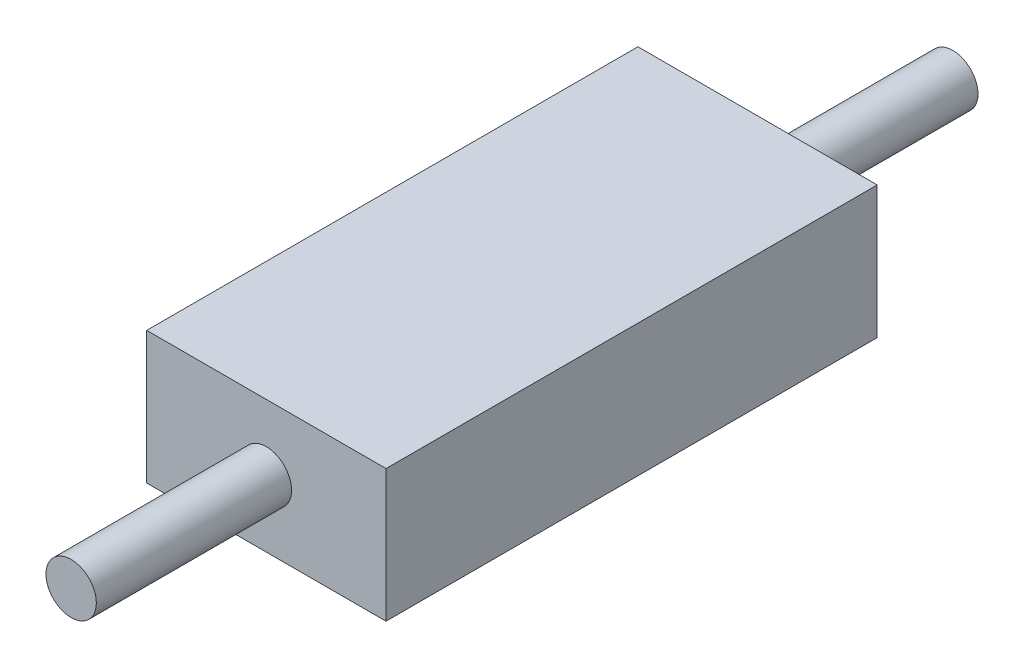
ISO-10303-21;
HEADER;
FILE_DESCRIPTION(('STEP AP214'),'2;1');
FILE_NAME('part.step','',(''),(''),'','','');
FILE_SCHEMA(('AUTOMOTIVE_DESIGN { 1 0 10303 214 1 1 1 1 }'));
ENDSEC;
DATA;
#1=APPLICATION_CONTEXT('core data for automotive mechanical design processes');
#2=APPLICATION_PROTOCOL_DEFINITION('international standard','automotive_design',2000,#1);
#3=PRODUCT_CONTEXT('',#1,'mechanical');
#4=PRODUCT('Part','Part','',(#3));
#5=PRODUCT_RELATED_PRODUCT_CATEGORY('part','',(#4));
#6=PRODUCT_DEFINITION_FORMATION('','',#4);
#7=PRODUCT_DEFINITION_CONTEXT('part definition',#1,'design');
#8=PRODUCT_DEFINITION('design','',#6,#7);
#9=PRODUCT_DEFINITION_SHAPE('','',#8);
#10=(LENGTH_UNIT() NAMED_UNIT(*) SI_UNIT(.MILLI.,.METRE.));
#11=(NAMED_UNIT(*) PLANE_ANGLE_UNIT() SI_UNIT($,.RADIAN.));
#12=(NAMED_UNIT(*) SI_UNIT($,.STERADIAN.) SOLID_ANGLE_UNIT());
#13=UNCERTAINTY_MEASURE_WITH_UNIT(LENGTH_MEASURE(1.E-05),#10,'distance_accuracy_value','');
#14=(GEOMETRIC_REPRESENTATION_CONTEXT(3) GLOBAL_UNCERTAINTY_ASSIGNED_CONTEXT((#13)) GLOBAL_UNIT_ASSIGNED_CONTEXT((#10,
#11,#12)) REPRESENTATION_CONTEXT('',''));
#15=CARTESIAN_POINT('',(0.,0.,0.));
#16=DIRECTION('',(0.,0.,1.));
#17=DIRECTION('',(1.,0.,0.));
#18=AXIS2_PLACEMENT_3D('',#15,#16,#17);
#19=CARTESIAN_POINT('',(19.,-10.5,78.));
#20=DIRECTION('',(-1.,0.,0.));
#21=DIRECTION('',(0.,0.,1.));
#22=AXIS2_PLACEMENT_3D('',#19,#20,#21);
#23=PLANE('',#22);
#24=DIRECTION('',(0.,1.,0.));
#25=VECTOR('',#24,1.);
#26=CARTESIAN_POINT('',(19.,-10.5,0.));
#27=LINE('',#26,#25);
#28=CARTESIAN_POINT('',(19.,-10.5,0.));
#29=VERTEX_POINT('',#28);
#30=CARTESIAN_POINT('',(19.,10.5,0.));
#31=VERTEX_POINT('',#30);
#32=EDGE_CURVE('E108',#29,#31,#27,.T.);
#33=ORIENTED_EDGE('',*,*,#32,.T.);
#34=DIRECTION('',(0.,0.,-1.));
#35=VECTOR('',#34,1.);
#36=CARTESIAN_POINT('',(19.,10.5,78.));
#37=LINE('',#36,#35);
#38=CARTESIAN_POINT('',(19.,10.5,78.));
#39=VERTEX_POINT('',#38);
#40=EDGE_CURVE('E13',#39,#31,#37,.T.);
#41=ORIENTED_EDGE('',*,*,#40,.F.);
#42=DIRECTION('',(0.,1.,0.));
#43=VECTOR('',#42,1.);
#44=CARTESIAN_POINT('',(19.,-10.5,78.));
#45=LINE('',#44,#43);
#46=CARTESIAN_POINT('',(19.,-10.5,78.));
#47=VERTEX_POINT('',#46);
#48=EDGE_CURVE('E96',#47,#39,#45,.T.);
#49=ORIENTED_EDGE('',*,*,#48,.F.);
#50=DIRECTION('',(0.,0.,-1.));
#51=VECTOR('',#50,1.);
#52=CARTESIAN_POINT('',(19.,-10.5,78.));
#53=LINE('',#52,#51);
#54=EDGE_CURVE('E104',#47,#29,#53,.T.);
#55=ORIENTED_EDGE('',*,*,#54,.T.);
#56=EDGE_LOOP('',(#33,#41,#49,#55));
#57=FACE_BOUND('',#56,.T.);
#58=ADVANCED_FACE('F45',(#57),#23,.F.);
#59=CARTESIAN_POINT('',(-19.,10.5,78.));
#60=DIRECTION('',(0.,-1.,0.));
#61=DIRECTION('',(0.,0.,-1.));
#62=AXIS2_PLACEMENT_3D('',#59,#60,#61);
#63=PLANE('',#62);
#64=DIRECTION('',(-1.,0.,0.));
#65=VECTOR('',#64,1.);
#66=CARTESIAN_POINT('',(-19.,10.5,0.));
#67=LINE('',#66,#65);
#68=CARTESIAN_POINT('',(-19.,10.5,0.));
#69=VERTEX_POINT('',#68);
#70=EDGE_CURVE('E100',#31,#69,#67,.T.);
#71=ORIENTED_EDGE('',*,*,#70,.T.);
#72=DIRECTION('',(0.,0.,-1.));
#73=VECTOR('',#72,1.);
#74=CARTESIAN_POINT('',(-19.,10.5,78.));
#75=LINE('',#74,#73);
#76=CARTESIAN_POINT('',(-19.,10.5,78.));
#77=VERTEX_POINT('',#76);
#78=EDGE_CURVE('E53',#77,#69,#75,.T.);
#79=ORIENTED_EDGE('',*,*,#78,.F.);
#80=DIRECTION('',(-1.,0.,0.));
#81=VECTOR('',#80,1.);
#82=CARTESIAN_POINT('',(-19.,10.5,78.));
#83=LINE('',#82,#81);
#84=EDGE_CURVE('E91',#39,#77,#83,.T.);
#85=ORIENTED_EDGE('',*,*,#84,.F.);
#86=ORIENTED_EDGE('',*,*,#40,.T.);
#87=EDGE_LOOP('',(#71,#79,#85,#86));
#88=FACE_BOUND('',#87,.T.);
#89=ADVANCED_FACE('F99',(#88),#63,.F.);
#90=CARTESIAN_POINT('',(-19.,-10.5,78.));
#91=DIRECTION('',(1.,0.,0.));
#92=DIRECTION('',(0.,0.,-1.));
#93=AXIS2_PLACEMENT_3D('',#90,#91,#92);
#94=PLANE('',#93);
#95=DIRECTION('',(0.,-1.,0.));
#96=VECTOR('',#95,1.);
#97=CARTESIAN_POINT('',(-19.,-10.5,0.));
#98=LINE('',#97,#96);
#99=CARTESIAN_POINT('',(-19.,-10.5,0.));
#100=VERTEX_POINT('',#99);
#101=EDGE_CURVE('E78',#69,#100,#98,.T.);
#102=ORIENTED_EDGE('',*,*,#101,.T.);
#103=DIRECTION('',(0.,0.,-1.));
#104=VECTOR('',#103,1.);
#105=CARTESIAN_POINT('',(-19.,-10.5,78.));
#106=LINE('',#105,#104);
#107=CARTESIAN_POINT('',(-19.,-10.5,78.));
#108=VERTEX_POINT('',#107);
#109=EDGE_CURVE('E101',#108,#100,#106,.T.);
#110=ORIENTED_EDGE('',*,*,#109,.F.);
#111=DIRECTION('',(0.,-1.,0.));
#112=VECTOR('',#111,1.);
#113=CARTESIAN_POINT('',(-19.,-10.5,78.));
#114=LINE('',#113,#112);
#115=EDGE_CURVE('E94',#77,#108,#114,.T.);
#116=ORIENTED_EDGE('',*,*,#115,.F.);
#117=ORIENTED_EDGE('',*,*,#78,.T.);
#118=EDGE_LOOP('',(#102,#110,#116,#117));
#119=FACE_BOUND('',#118,.T.);
#120=ADVANCED_FACE('F102',(#119),#94,.F.);
#121=CARTESIAN_POINT('',(-19.,-10.5,78.));
#122=DIRECTION('',(0.,1.,0.));
#123=DIRECTION('',(0.,0.,1.));
#124=AXIS2_PLACEMENT_3D('',#121,#122,#123);
#125=PLANE('',#124);
#126=DIRECTION('',(1.,0.,0.));
#127=VECTOR('',#126,1.);
#128=CARTESIAN_POINT('',(-19.,-10.5,0.));
#129=LINE('',#128,#127);
#130=EDGE_CURVE('E84',#100,#29,#129,.T.);
#131=ORIENTED_EDGE('',*,*,#130,.T.);
#132=ORIENTED_EDGE('',*,*,#54,.F.);
#133=DIRECTION('',(1.,0.,0.));
#134=VECTOR('',#133,1.);
#135=CARTESIAN_POINT('',(-19.,-10.5,78.));
#136=LINE('',#135,#134);
#137=EDGE_CURVE('E61',#108,#47,#136,.T.);
#138=ORIENTED_EDGE('',*,*,#137,.F.);
#139=ORIENTED_EDGE('',*,*,#109,.T.);
#140=EDGE_LOOP('',(#131,#132,#138,#139));
#141=FACE_BOUND('',#140,.T.);
#142=ADVANCED_FACE('F116',(#141),#125,.F.);
#143=CARTESIAN_POINT('',(0.,0.,78.));
#144=DIRECTION('',(0.,0.,-1.));
#145=DIRECTION('',(-1.,0.,0.));
#146=AXIS2_PLACEMENT_3D('',#143,#144,#145);
#147=PLANE('',#146);
#148=CARTESIAN_POINT('',(0.,0.,78.));
#149=DIRECTION('',(0.,0.,1.));
#150=DIRECTION('',(1.,0.,0.));
#151=AXIS2_PLACEMENT_3D('',#148,#149,#150);
#152=CIRCLE('',#151,4.);
#153=CARTESIAN_POINT('',(4.,0.,78.));
#154=VERTEX_POINT('',#153);
#155=EDGE_CURVE('E111',#154,#154,#152,.T.);
#156=ORIENTED_EDGE('',*,*,#155,.F.);
#157=EDGE_LOOP('',(#156));
#158=FACE_BOUND('',#157,.T.);
#159=ORIENTED_EDGE('',*,*,#48,.T.);
#160=ORIENTED_EDGE('',*,*,#84,.T.);
#161=ORIENTED_EDGE('',*,*,#115,.T.);
#162=ORIENTED_EDGE('',*,*,#137,.T.);
#163=EDGE_LOOP('',(#159,#160,#161,#162));
#164=FACE_BOUND('',#163,.T.);
#165=ADVANCED_FACE('F92',(#158,#164),#147,.F.);
#166=CARTESIAN_POINT('',(0.,0.,0.));
#167=DIRECTION('',(0.,0.,-1.));
#168=DIRECTION('',(-1.,0.,0.));
#169=AXIS2_PLACEMENT_3D('',#166,#167,#168);
#170=PLANE('',#169);
#171=CARTESIAN_POINT('',(0.,0.,0.));
#172=DIRECTION('',(0.,0.,-1.));
#173=DIRECTION('',(-1.,0.,0.));
#174=AXIS2_PLACEMENT_3D('',#171,#172,#173);
#175=CIRCLE('',#174,4.);
#176=CARTESIAN_POINT('',(-4.,0.,0.));
#177=VERTEX_POINT('',#176);
#178=EDGE_CURVE('E124',#177,#177,#175,.T.);
#179=ORIENTED_EDGE('',*,*,#178,.F.);
#180=EDGE_LOOP('',(#179));
#181=FACE_BOUND('',#180,.T.);
#182=ORIENTED_EDGE('',*,*,#32,.F.);
#183=ORIENTED_EDGE('',*,*,#130,.F.);
#184=ORIENTED_EDGE('',*,*,#101,.F.);
#185=ORIENTED_EDGE('',*,*,#70,.F.);
#186=EDGE_LOOP('',(#182,#183,#184,#185));
#187=FACE_BOUND('',#186,.T.);
#188=ADVANCED_FACE('F119',(#181,#187),#170,.T.);
#189=CARTESIAN_POINT('',(0.,0.,-31.));
#190=DIRECTION('',(0.,0.,1.));
#191=DIRECTION('',(1.,0.,0.));
#192=AXIS2_PLACEMENT_3D('',#189,#190,#191);
#193=PLANE('',#192);
#194=CARTESIAN_POINT('',(0.,0.,-31.));
#195=DIRECTION('',(0.,0.,1.));
#196=DIRECTION('',(1.,0.,0.));
#197=AXIS2_PLACEMENT_3D('',#194,#195,#196);
#198=CIRCLE('',#197,4.);
#199=CARTESIAN_POINT('',(4.,0.,-31.));
#200=VERTEX_POINT('',#199);
#201=EDGE_CURVE('E127',#200,#200,#198,.T.);
#202=ORIENTED_EDGE('',*,*,#201,.F.);
#203=EDGE_LOOP('',(#202));
#204=FACE_BOUND('',#203,.T.);
#205=ADVANCED_FACE('F136',(#204),#193,.F.);
#206=CARTESIAN_POINT('',(0.,0.,-31.));
#207=DIRECTION('',(0.,0.,1.));
#208=DIRECTION('',(1.,0.,0.));
#209=AXIS2_PLACEMENT_3D('',#206,#207,#208);
#210=CYLINDRICAL_SURFACE('',#209,4.);
#211=ORIENTED_EDGE('',*,*,#178,.T.);
#212=EDGE_LOOP('',(#211));
#213=FACE_BOUND('',#212,.T.);
#214=ORIENTED_EDGE('',*,*,#201,.T.);
#215=EDGE_LOOP('',(#214));
#216=FACE_BOUND('',#215,.T.);
#217=ADVANCED_FACE('F134',(#213,#216),#210,.T.);
#218=CARTESIAN_POINT('',(0.,0.,109.));
#219=DIRECTION('',(0.,0.,1.));
#220=DIRECTION('',(1.,0.,0.));
#221=AXIS2_PLACEMENT_3D('',#218,#219,#220);
#222=CIRCLE('',#221,4.);
#223=CARTESIAN_POINT('',(4.,0.,109.));
#224=VERTEX_POINT('',#223);
#225=EDGE_CURVE('E128',#224,#224,#222,.T.);
#226=ORIENTED_EDGE('',*,*,#225,.F.);
#227=EDGE_LOOP('',(#226));
#228=FACE_BOUND('',#227,.T.);
#229=ORIENTED_EDGE('',*,*,#155,.T.);
#230=EDGE_LOOP('',(#229));
#231=FACE_BOUND('',#230,.T.);
#232=ADVANCED_FACE('F143',(#228,#231),#210,.T.);
#233=CARTESIAN_POINT('',(0.,0.,109.));
#234=DIRECTION('',(0.,0.,1.));
#235=DIRECTION('',(1.,0.,0.));
#236=AXIS2_PLACEMENT_3D('',#233,#234,#235);
#237=PLANE('',#236);
#238=ORIENTED_EDGE('',*,*,#225,.T.);
#239=EDGE_LOOP('',(#238));
#240=FACE_BOUND('',#239,.T.);
#241=ADVANCED_FACE('F162',(#240),#237,.T.);
#242=CLOSED_SHELL('',(#58,#89,#120,#142,#165,#188,#205,#217,#232,#241));
#243=MANIFOLD_SOLID_BREP('B2',#242);
#244=ADVANCED_BREP_SHAPE_REPRESENTATION('',(#18,#243),#14);
#245=SHAPE_DEFINITION_REPRESENTATION(#9,#244);
ENDSEC;
END-ISO-10303-21;
